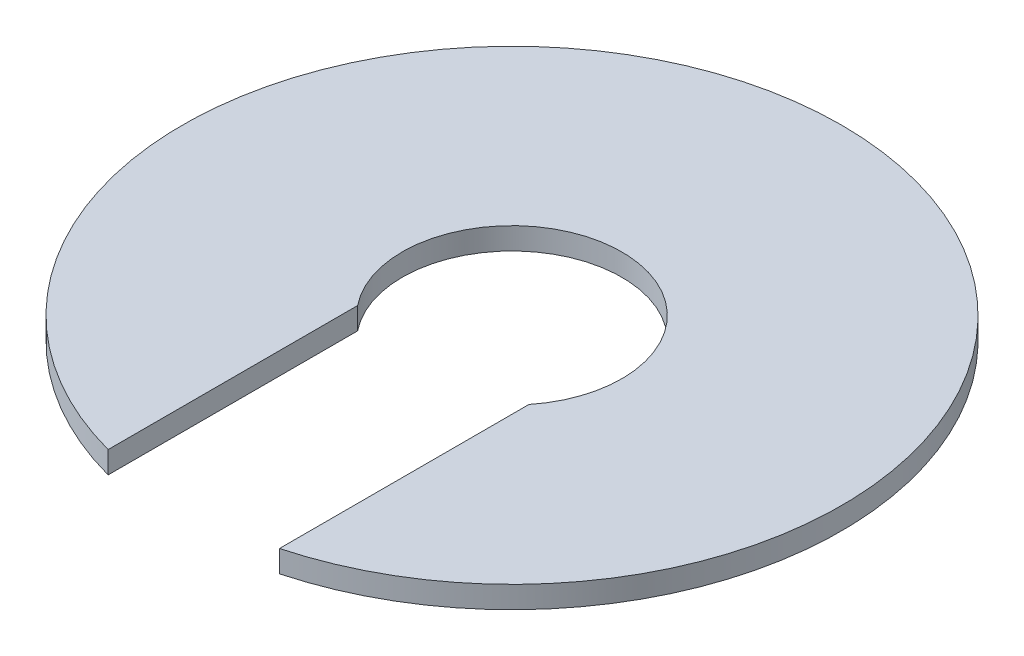
ISO-10303-21;
HEADER;
FILE_DESCRIPTION(('STEP AP214'),'2;1');
FILE_NAME('part.step','',(''),(''),'','','');
FILE_SCHEMA(('AUTOMOTIVE_DESIGN { 1 0 10303 214 1 1 1 1 }'));
ENDSEC;
DATA;
#1=APPLICATION_CONTEXT('core data for automotive mechanical design processes');
#2=APPLICATION_PROTOCOL_DEFINITION('international standard','automotive_design',2000,#1);
#3=PRODUCT_CONTEXT('',#1,'mechanical');
#4=PRODUCT('Part','Part','',(#3));
#5=PRODUCT_RELATED_PRODUCT_CATEGORY('part','',(#4));
#6=PRODUCT_DEFINITION_FORMATION('','',#4);
#7=PRODUCT_DEFINITION_CONTEXT('part definition',#1,'design');
#8=PRODUCT_DEFINITION('design','',#6,#7);
#9=PRODUCT_DEFINITION_SHAPE('','',#8);
#10=(LENGTH_UNIT() NAMED_UNIT(*) SI_UNIT(.MILLI.,.METRE.));
#11=(NAMED_UNIT(*) PLANE_ANGLE_UNIT() SI_UNIT($,.RADIAN.));
#12=(NAMED_UNIT(*) SI_UNIT($,.STERADIAN.) SOLID_ANGLE_UNIT());
#13=UNCERTAINTY_MEASURE_WITH_UNIT(LENGTH_MEASURE(1.E-05),#10,'distance_accuracy_value','');
#14=(GEOMETRIC_REPRESENTATION_CONTEXT(3) GLOBAL_UNCERTAINTY_ASSIGNED_CONTEXT((#13)) GLOBAL_UNIT_ASSIGNED_CONTEXT((#10,
#11,#12)) REPRESENTATION_CONTEXT('',''));
#15=CARTESIAN_POINT('',(0.,0.,0.));
#16=DIRECTION('',(0.,0.,1.));
#17=DIRECTION('',(1.,0.,0.));
#18=AXIS2_PLACEMENT_3D('',#15,#16,#17);
#19=CARTESIAN_POINT('',(0.,0.254,0.));
#20=DIRECTION('',(0.,-1.,0.));
#21=DIRECTION('',(0.,0.,-1.));
#22=AXIS2_PLACEMENT_3D('',#19,#20,#21);
#23=CYLINDRICAL_SURFACE('',#22,1.27);
#24=CARTESIAN_POINT('',(0.,0.,0.));
#25=DIRECTION('',(0.,1.,0.));
#26=DIRECTION('',(0.,0.,1.));
#27=AXIS2_PLACEMENT_3D('',#24,#25,#26);
#28=CIRCLE('',#27,1.27);
#29=CARTESIAN_POINT('',(0.990450861063572,0.,0.79492584045207));
#30=VERTEX_POINT('',#29);
#31=CARTESIAN_POINT('',(-0.990450861063572,0.,0.79492584045207));
#32=VERTEX_POINT('',#31);
#33=EDGE_CURVE('E121',#30,#32,#28,.T.);
#34=ORIENTED_EDGE('',*,*,#33,.F.);
#35=DIRECTION('',(0.,-1.,0.));
#36=VECTOR('',#35,1.);
#37=CARTESIAN_POINT('',(0.990450861063572,0.254,0.79492584045207));
#38=LINE('',#37,#36);
#39=CARTESIAN_POINT('',(0.990450861063572,0.254,0.79492584045207));
#40=VERTEX_POINT('',#39);
#41=EDGE_CURVE('E11',#40,#30,#38,.T.);
#42=ORIENTED_EDGE('',*,*,#41,.F.);
#43=CARTESIAN_POINT('',(0.,0.254,0.));
#44=DIRECTION('',(0.,1.,0.));
#45=DIRECTION('',(0.,0.,1.));
#46=AXIS2_PLACEMENT_3D('',#43,#44,#45);
#47=CIRCLE('',#46,1.27);
#48=CARTESIAN_POINT('',(-0.990450861063572,0.254,0.79492584045207));
#49=VERTEX_POINT('',#48);
#50=EDGE_CURVE('E102',#40,#49,#47,.T.);
#51=ORIENTED_EDGE('',*,*,#50,.T.);
#52=DIRECTION('',(0.,-1.,0.));
#53=VECTOR('',#52,1.);
#54=CARTESIAN_POINT('',(-0.990450861063572,0.254,0.79492584045207));
#55=LINE('',#54,#53);
#56=EDGE_CURVE('E69',#49,#32,#55,.T.);
#57=ORIENTED_EDGE('',*,*,#56,.T.);
#58=EDGE_LOOP('',(#34,#42,#51,#57));
#59=FACE_BOUND('',#58,.T.);
#60=ADVANCED_FACE('F49',(#59),#23,.F.);
#61=CARTESIAN_POINT('',(0.990450861063572,0.254,0.));
#62=DIRECTION('',(1.,0.,0.));
#63=DIRECTION('',(0.,0.,-1.));
#64=AXIS2_PLACEMENT_3D('',#61,#62,#63);
#65=PLANE('',#64);
#66=DIRECTION('',(0.,0.,1.));
#67=VECTOR('',#66,1.);
#68=CARTESIAN_POINT('',(0.990450861063572,0.,0.));
#69=LINE('',#68,#67);
#70=CARTESIAN_POINT('',(0.990450861063572,0.,3.67900898229651));
#71=VERTEX_POINT('',#70);
#72=EDGE_CURVE('E109',#30,#71,#69,.T.);
#73=ORIENTED_EDGE('',*,*,#72,.T.);
#74=DIRECTION('',(0.,-1.,0.));
#75=VECTOR('',#74,1.);
#76=CARTESIAN_POINT('',(0.990450861063572,0.254,3.67900898229651));
#77=LINE('',#76,#75);
#78=CARTESIAN_POINT('',(0.990450861063572,0.254,3.67900898229651));
#79=VERTEX_POINT('',#78);
#80=EDGE_CURVE('E58',#79,#71,#77,.T.);
#81=ORIENTED_EDGE('',*,*,#80,.F.);
#82=DIRECTION('',(0.,0.,1.));
#83=VECTOR('',#82,1.);
#84=CARTESIAN_POINT('',(0.990450861063572,0.254,0.));
#85=LINE('',#84,#83);
#86=EDGE_CURVE('E96',#40,#79,#85,.T.);
#87=ORIENTED_EDGE('',*,*,#86,.F.);
#88=ORIENTED_EDGE('',*,*,#41,.T.);
#89=EDGE_LOOP('',(#73,#81,#87,#88));
#90=FACE_BOUND('',#89,.T.);
#91=ADVANCED_FACE('F107',(#90),#65,.F.);
#92=CARTESIAN_POINT('',(0.,0.254,0.));
#93=DIRECTION('',(0.,-1.,0.));
#94=DIRECTION('',(0.,0.,-1.));
#95=AXIS2_PLACEMENT_3D('',#92,#93,#94);
#96=CYLINDRICAL_SURFACE('',#95,3.81);
#97=CARTESIAN_POINT('',(0.,0.,0.));
#98=DIRECTION('',(0.,1.,0.));
#99=DIRECTION('',(0.,0.,1.));
#100=AXIS2_PLACEMENT_3D('',#97,#98,#99);
#101=CIRCLE('',#100,3.81);
#102=CARTESIAN_POINT('',(-0.990450861063572,0.,3.67900898229651));
#103=VERTEX_POINT('',#102);
#104=EDGE_CURVE('E126',#71,#103,#101,.T.);
#105=ORIENTED_EDGE('',*,*,#104,.T.);
#106=DIRECTION('',(0.,-1.,0.));
#107=VECTOR('',#106,1.);
#108=CARTESIAN_POINT('',(-0.990450861063572,0.254,3.67900898229651));
#109=LINE('',#108,#107);
#110=CARTESIAN_POINT('',(-0.990450861063572,0.254,3.67900898229651));
#111=VERTEX_POINT('',#110);
#112=EDGE_CURVE('E84',#111,#103,#109,.T.);
#113=ORIENTED_EDGE('',*,*,#112,.F.);
#114=CARTESIAN_POINT('',(0.,0.254,0.));
#115=DIRECTION('',(0.,1.,0.));
#116=DIRECTION('',(0.,0.,1.));
#117=AXIS2_PLACEMENT_3D('',#114,#115,#116);
#118=CIRCLE('',#117,3.81);
#119=EDGE_CURVE('E101',#79,#111,#118,.T.);
#120=ORIENTED_EDGE('',*,*,#119,.F.);
#121=ORIENTED_EDGE('',*,*,#80,.T.);
#122=EDGE_LOOP('',(#105,#113,#120,#121));
#123=FACE_BOUND('',#122,.T.);
#124=ADVANCED_FACE('F113',(#123),#96,.T.);
#125=CARTESIAN_POINT('',(-0.990450861063572,0.254,0.));
#126=DIRECTION('',(1.,0.,0.));
#127=DIRECTION('',(0.,0.,-1.));
#128=AXIS2_PLACEMENT_3D('',#125,#126,#127);
#129=PLANE('',#128);
#130=DIRECTION('',(0.,0.,1.));
#131=VECTOR('',#130,1.);
#132=CARTESIAN_POINT('',(-0.990450861063572,0.,0.));
#133=LINE('',#132,#131);
#134=EDGE_CURVE('E129',#32,#103,#133,.T.);
#135=ORIENTED_EDGE('',*,*,#134,.F.);
#136=ORIENTED_EDGE('',*,*,#56,.F.);
#137=DIRECTION('',(0.,0.,1.));
#138=VECTOR('',#137,1.);
#139=CARTESIAN_POINT('',(-0.990450861063572,0.254,0.));
#140=LINE('',#139,#138);
#141=EDGE_CURVE('E115',#49,#111,#140,.T.);
#142=ORIENTED_EDGE('',*,*,#141,.T.);
#143=ORIENTED_EDGE('',*,*,#112,.T.);
#144=EDGE_LOOP('',(#135,#136,#142,#143));
#145=FACE_BOUND('',#144,.T.);
#146=ADVANCED_FACE('F138',(#145),#129,.T.);
#147=CARTESIAN_POINT('',(0.,0.254,0.));
#148=DIRECTION('',(0.,1.,0.));
#149=DIRECTION('',(0.,0.,1.));
#150=AXIS2_PLACEMENT_3D('',#147,#148,#149);
#151=PLANE('',#150);
#152=ORIENTED_EDGE('',*,*,#50,.F.);
#153=ORIENTED_EDGE('',*,*,#86,.T.);
#154=ORIENTED_EDGE('',*,*,#119,.T.);
#155=ORIENTED_EDGE('',*,*,#141,.F.);
#156=EDGE_LOOP('',(#152,#153,#154,#155));
#157=FACE_BOUND('',#156,.T.);
#158=ADVANCED_FACE('F98',(#157),#151,.T.);
#159=CARTESIAN_POINT('',(0.,0.,0.));
#160=DIRECTION('',(0.,1.,0.));
#161=DIRECTION('',(0.,0.,1.));
#162=AXIS2_PLACEMENT_3D('',#159,#160,#161);
#163=PLANE('',#162);
#164=ORIENTED_EDGE('',*,*,#33,.T.);
#165=ORIENTED_EDGE('',*,*,#134,.T.);
#166=ORIENTED_EDGE('',*,*,#104,.F.);
#167=ORIENTED_EDGE('',*,*,#72,.F.);
#168=EDGE_LOOP('',(#164,#165,#166,#167));
#169=FACE_BOUND('',#168,.T.);
#170=ADVANCED_FACE('F145',(#169),#163,.F.);
#171=CLOSED_SHELL('',(#60,#91,#124,#146,#158,#170));
#172=MANIFOLD_SOLID_BREP('B2',#171);
#173=ADVANCED_BREP_SHAPE_REPRESENTATION('',(#18,#172),#14);
#174=SHAPE_DEFINITION_REPRESENTATION(#9,#173);
ENDSEC;
END-ISO-10303-21;
